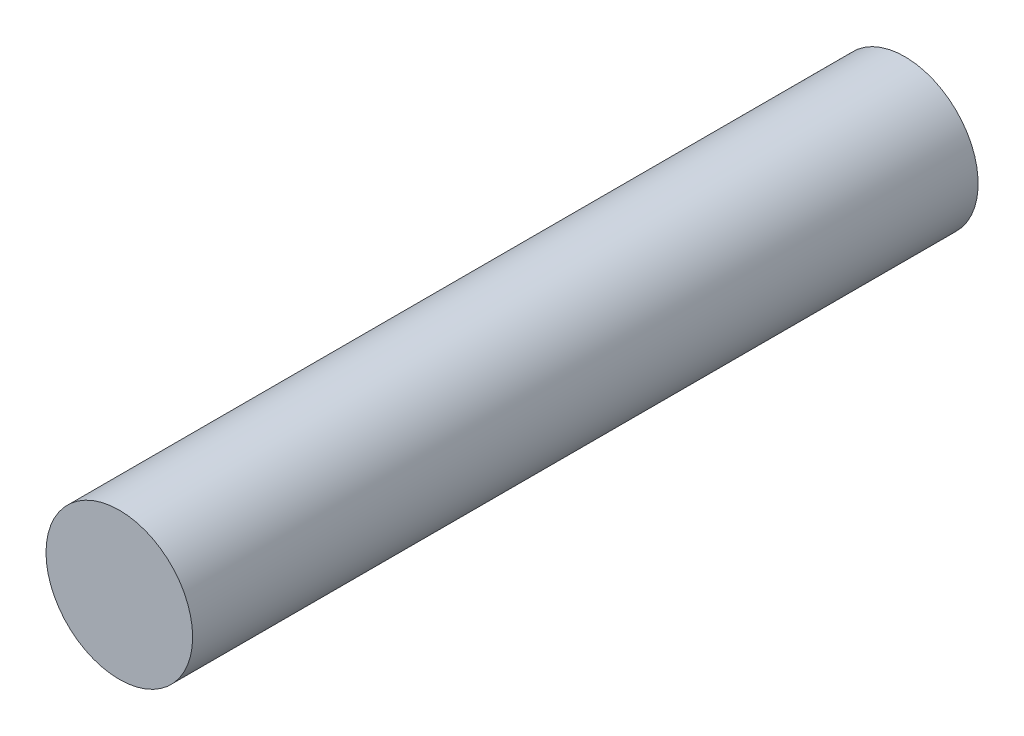
ISO-10303-21;
HEADER;
FILE_DESCRIPTION(('STEP AP214'),'2;1');
FILE_NAME('part.step','',(''),(''),'','','');
FILE_SCHEMA(('AUTOMOTIVE_DESIGN { 1 0 10303 214 1 1 1 1 }'));
ENDSEC;
DATA;
#1=APPLICATION_CONTEXT('core data for automotive mechanical design processes');
#2=APPLICATION_PROTOCOL_DEFINITION('international standard','automotive_design',2000,#1);
#3=PRODUCT_CONTEXT('',#1,'mechanical');
#4=PRODUCT('Part','Part','',(#3));
#5=PRODUCT_RELATED_PRODUCT_CATEGORY('part','',(#4));
#6=PRODUCT_DEFINITION_FORMATION('','',#4);
#7=PRODUCT_DEFINITION_CONTEXT('part definition',#1,'design');
#8=PRODUCT_DEFINITION('design','',#6,#7);
#9=PRODUCT_DEFINITION_SHAPE('','',#8);
#10=(LENGTH_UNIT() NAMED_UNIT(*) SI_UNIT(.MILLI.,.METRE.));
#11=(NAMED_UNIT(*) PLANE_ANGLE_UNIT() SI_UNIT($,.RADIAN.));
#12=(NAMED_UNIT(*) SI_UNIT($,.STERADIAN.) SOLID_ANGLE_UNIT());
#13=UNCERTAINTY_MEASURE_WITH_UNIT(LENGTH_MEASURE(1.E-05),#10,'distance_accuracy_value','');
#14=(GEOMETRIC_REPRESENTATION_CONTEXT(3) GLOBAL_UNCERTAINTY_ASSIGNED_CONTEXT((#13)) GLOBAL_UNIT_ASSIGNED_CONTEXT((#10,
#11,#12)) REPRESENTATION_CONTEXT('',''));
#15=CARTESIAN_POINT('',(0.,0.,0.));
#16=DIRECTION('',(0.,0.,1.));
#17=DIRECTION('',(1.,0.,0.));
#18=AXIS2_PLACEMENT_3D('',#15,#16,#17);
#19=CARTESIAN_POINT('',(0.,0.,50.));
#20=DIRECTION('',(0.,0.,-1.));
#21=DIRECTION('',(-1.,0.,0.));
#22=AXIS2_PLACEMENT_3D('',#19,#20,#21);
#23=CYLINDRICAL_SURFACE('',#22,7.);
#24=CARTESIAN_POINT('',(0.,0.,50.));
#25=DIRECTION('',(0.,0.,1.));
#26=DIRECTION('',(1.,0.,0.));
#27=AXIS2_PLACEMENT_3D('',#24,#25,#26);
#28=CIRCLE('',#27,7.);
#29=CARTESIAN_POINT('',(7.,0.,50.));
#30=VERTEX_POINT('',#29);
#31=EDGE_CURVE('E10',#30,#30,#28,.T.);
#32=ORIENTED_EDGE('',*,*,#31,.F.);
#33=EDGE_LOOP('',(#32));
#34=FACE_BOUND('',#33,.T.);
#35=CARTESIAN_POINT('',(0.,0.,-25.));
#36=DIRECTION('',(0.,0.,-1.));
#37=DIRECTION('',(-1.,0.,0.));
#38=AXIS2_PLACEMENT_3D('',#35,#36,#37);
#39=CIRCLE('',#38,7.);
#40=CARTESIAN_POINT('',(-7.,0.,-25.));
#41=VERTEX_POINT('',#40);
#42=EDGE_CURVE('E44',#41,#41,#39,.T.);
#43=ORIENTED_EDGE('',*,*,#42,.F.);
#44=EDGE_LOOP('',(#43));
#45=FACE_BOUND('',#44,.T.);
#46=ADVANCED_FACE('F37',(#34,#45),#23,.T.);
#47=CARTESIAN_POINT('',(0.,0.,50.));
#48=DIRECTION('',(0.,0.,1.));
#49=DIRECTION('',(1.,0.,0.));
#50=AXIS2_PLACEMENT_3D('',#47,#48,#49);
#51=PLANE('',#50);
#52=ORIENTED_EDGE('',*,*,#31,.T.);
#53=EDGE_LOOP('',(#52));
#54=FACE_BOUND('',#53,.T.);
#55=ADVANCED_FACE('F54',(#54),#51,.T.);
#56=CARTESIAN_POINT('',(0.,0.,-25.));
#57=DIRECTION('',(0.,0.,-1.));
#58=DIRECTION('',(-1.,0.,0.));
#59=AXIS2_PLACEMENT_3D('',#56,#57,#58);
#60=PLANE('',#59);
#61=ORIENTED_EDGE('',*,*,#42,.T.);
#62=EDGE_LOOP('',(#61));
#63=FACE_BOUND('',#62,.T.);
#64=ADVANCED_FACE('F51',(#63),#60,.T.);
#65=CLOSED_SHELL('',(#46,#55,#64));
#66=MANIFOLD_SOLID_BREP('B2',#65);
#67=ADVANCED_BREP_SHAPE_REPRESENTATION('',(#18,#66),#14);
#68=SHAPE_DEFINITION_REPRESENTATION(#9,#67);
ENDSEC;
END-ISO-10303-21;
